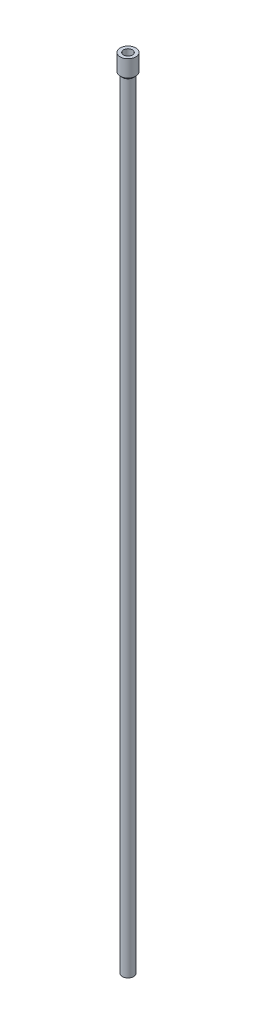
ISO-10303-21;
HEADER;
FILE_DESCRIPTION(('STEP AP214'),'2;1');
FILE_NAME('part.step','',(''),(''),'','','');
FILE_SCHEMA(('AUTOMOTIVE_DESIGN { 1 0 10303 214 1 1 1 1 }'));
ENDSEC;
DATA;
#1=APPLICATION_CONTEXT('core data for automotive mechanical design processes');
#2=APPLICATION_PROTOCOL_DEFINITION('international standard','automotive_design',2000,#1);
#3=PRODUCT_CONTEXT('',#1,'mechanical');
#4=PRODUCT('Part','Part','',(#3));
#5=PRODUCT_RELATED_PRODUCT_CATEGORY('part','',(#4));
#6=PRODUCT_DEFINITION_FORMATION('','',#4);
#7=PRODUCT_DEFINITION_CONTEXT('part definition',#1,'design');
#8=PRODUCT_DEFINITION('design','',#6,#7);
#9=PRODUCT_DEFINITION_SHAPE('','',#8);
#10=(LENGTH_UNIT() NAMED_UNIT(*) SI_UNIT(.MILLI.,.METRE.));
#11=(NAMED_UNIT(*) PLANE_ANGLE_UNIT() SI_UNIT($,.RADIAN.));
#12=(NAMED_UNIT(*) SI_UNIT($,.STERADIAN.) SOLID_ANGLE_UNIT());
#13=UNCERTAINTY_MEASURE_WITH_UNIT(LENGTH_MEASURE(1.E-05),#10,'distance_accuracy_value','');
#14=(GEOMETRIC_REPRESENTATION_CONTEXT(3) GLOBAL_UNCERTAINTY_ASSIGNED_CONTEXT((#13)) GLOBAL_UNIT_ASSIGNED_CONTEXT((#10,
#11,#12)) REPRESENTATION_CONTEXT('',''));
#15=CARTESIAN_POINT('',(0.,0.,0.));
#16=DIRECTION('',(0.,0.,1.));
#17=DIRECTION('',(1.,0.,0.));
#18=AXIS2_PLACEMENT_3D('',#15,#16,#17);
#19=CARTESIAN_POINT('',(0.,15.,0.));
#20=DIRECTION('',(0.,1.,0.));
#21=DIRECTION('',(0.,0.,1.));
#22=AXIS2_PLACEMENT_3D('',#19,#20,#21);
#23=PLANE('',#22);
#24=CARTESIAN_POINT('',(0.,15.,0.));
#25=DIRECTION('',(0.,1.,0.));
#26=DIRECTION('',(0.,0.,1.));
#27=AXIS2_PLACEMENT_3D('',#24,#25,#26);
#28=CIRCLE('',#27,7.);
#29=CARTESIAN_POINT('',(0.,15.,7.));
#30=VERTEX_POINT('',#29);
#31=EDGE_CURVE('E52',#30,#30,#28,.T.);
#32=ORIENTED_EDGE('',*,*,#31,.T.);
#33=EDGE_LOOP('',(#32));
#34=FACE_BOUND('',#33,.T.);
#35=CARTESIAN_POINT('',(0.,15.,0.));
#36=DIRECTION('',(0.,1.,0.));
#37=DIRECTION('',(0.,0.,1.));
#38=AXIS2_PLACEMENT_3D('',#35,#36,#37);
#39=CIRCLE('',#38,4.);
#40=CARTESIAN_POINT('',(0.,15.,4.));
#41=VERTEX_POINT('',#40);
#42=EDGE_CURVE('E63',#41,#41,#39,.T.);
#43=ORIENTED_EDGE('',*,*,#42,.F.);
#44=EDGE_LOOP('',(#43));
#45=FACE_BOUND('',#44,.T.);
#46=ADVANCED_FACE('F43',(#34,#45),#23,.T.);
#47=CARTESIAN_POINT('',(0.,15.,0.));
#48=DIRECTION('',(0.,-1.,0.));
#49=DIRECTION('',(0.,0.,-1.));
#50=AXIS2_PLACEMENT_3D('',#47,#48,#49);
#51=CYLINDRICAL_SURFACE('',#50,7.);
#52=ORIENTED_EDGE('',*,*,#31,.F.);
#53=EDGE_LOOP('',(#52));
#54=FACE_BOUND('',#53,.T.);
#55=CARTESIAN_POINT('',(0.,0.,0.));
#56=DIRECTION('',(0.,1.,0.));
#57=DIRECTION('',(0.,0.,1.));
#58=AXIS2_PLACEMENT_3D('',#55,#56,#57);
#59=CIRCLE('',#58,7.);
#60=CARTESIAN_POINT('',(0.,0.,7.));
#61=VERTEX_POINT('',#60);
#62=EDGE_CURVE('E57',#61,#61,#59,.T.);
#63=ORIENTED_EDGE('',*,*,#62,.T.);
#64=EDGE_LOOP('',(#63));
#65=FACE_BOUND('',#64,.T.);
#66=ADVANCED_FACE('F93',(#54,#65),#51,.T.);
#67=CARTESIAN_POINT('',(0.,15.,0.));
#68=DIRECTION('',(0.,-1.,0.));
#69=DIRECTION('',(0.,0.,-1.));
#70=AXIS2_PLACEMENT_3D('',#67,#68,#69);
#71=CYLINDRICAL_SURFACE('',#70,4.);
#72=ORIENTED_EDGE('',*,*,#42,.T.);
#73=EDGE_LOOP('',(#72));
#74=FACE_BOUND('',#73,.T.);
#75=CARTESIAN_POINT('',(0.,0.,0.));
#76=DIRECTION('',(0.,1.,0.));
#77=DIRECTION('',(0.,0.,1.));
#78=AXIS2_PLACEMENT_3D('',#75,#76,#77);
#79=CIRCLE('',#78,4.);
#80=CARTESIAN_POINT('',(0.,0.,4.));
#81=VERTEX_POINT('',#80);
#82=EDGE_CURVE('E65',#81,#81,#79,.T.);
#83=ORIENTED_EDGE('',*,*,#82,.F.);
#84=EDGE_LOOP('',(#83));
#85=FACE_BOUND('',#84,.T.);
#86=ADVANCED_FACE('F88',(#74,#85),#71,.F.);
#87=CARTESIAN_POINT('',(0.,0.,0.));
#88=DIRECTION('',(0.,-1.,0.));
#89=DIRECTION('',(0.,0.,-1.));
#90=AXIS2_PLACEMENT_3D('',#87,#88,#89);
#91=PLANE('',#90);
#92=ORIENTED_EDGE('',*,*,#82,.T.);
#93=EDGE_LOOP('',(#92));
#94=FACE_BOUND('',#93,.T.);
#95=ADVANCED_FACE('F81',(#94),#91,.F.);
#96=CARTESIAN_POINT('',(0.,-700.,0.));
#97=DIRECTION('',(0.,1.,0.));
#98=DIRECTION('',(0.,0.,1.));
#99=AXIS2_PLACEMENT_3D('',#96,#97,#98);
#100=CYLINDRICAL_SURFACE('',#99,5.);
#101=CARTESIAN_POINT('',(0.,-2.00000000000022,0.));
#102=DIRECTION('',(0.,1.,0.));
#103=DIRECTION('',(0.,0.,1.));
#104=AXIS2_PLACEMENT_3D('',#101,#102,#103);
#105=CIRCLE('',#104,5.);
#106=CARTESIAN_POINT('',(0.,-2.00000000000022,5.));
#107=VERTEX_POINT('',#106);
#108=EDGE_CURVE('E10',#107,#107,#105,.F.);
#109=ORIENTED_EDGE('',*,*,#108,.T.);
#110=EDGE_LOOP('',(#109));
#111=FACE_BOUND('',#110,.T.);
#112=CARTESIAN_POINT('',(0.,-700.,0.));
#113=DIRECTION('',(0.,-1.,0.));
#114=DIRECTION('',(0.,0.,-1.));
#115=AXIS2_PLACEMENT_3D('',#112,#113,#114);
#116=CIRCLE('',#115,5.);
#117=CARTESIAN_POINT('',(0.,-700.,-5.));
#118=VERTEX_POINT('',#117);
#119=EDGE_CURVE('E69',#118,#118,#116,.T.);
#120=ORIENTED_EDGE('',*,*,#119,.F.);
#121=EDGE_LOOP('',(#120));
#122=FACE_BOUND('',#121,.T.);
#123=ADVANCED_FACE('F79',(#111,#122),#100,.T.);
#124=CARTESIAN_POINT('',(0.,-700.,0.));
#125=DIRECTION('',(0.,-1.,0.));
#126=DIRECTION('',(0.,0.,-1.));
#127=AXIS2_PLACEMENT_3D('',#124,#125,#126);
#128=PLANE('',#127);
#129=ORIENTED_EDGE('',*,*,#119,.T.);
#130=EDGE_LOOP('',(#129));
#131=FACE_BOUND('',#130,.T.);
#132=ADVANCED_FACE('F77',(#131),#128,.T.);
#133=CARTESIAN_POINT('',(0.,-2.00000000000022,0.));
#134=DIRECTION('',(0.,1.,0.));
#135=DIRECTION('',(0.,0.,1.));
#136=AXIS2_PLACEMENT_3D('',#133,#134,#135);
#137=CONICAL_SURFACE('',#136,5.,0.785398163397422);
#138=ORIENTED_EDGE('',*,*,#62,.F.);
#139=EDGE_LOOP('',(#138));
#140=FACE_BOUND('',#139,.T.);
#141=ORIENTED_EDGE('',*,*,#108,.F.);
#142=EDGE_LOOP('',(#141));
#143=FACE_BOUND('',#142,.T.);
#144=ADVANCED_FACE('F46',(#140,#143),#137,.T.);
#145=CLOSED_SHELL('',(#46,#66,#86,#95,#123,#132,#144));
#146=MANIFOLD_SOLID_BREP('B2',#145);
#147=ADVANCED_BREP_SHAPE_REPRESENTATION('',(#18,#146),#14);
#148=SHAPE_DEFINITION_REPRESENTATION(#9,#147);
ENDSEC;
END-ISO-10303-21;
